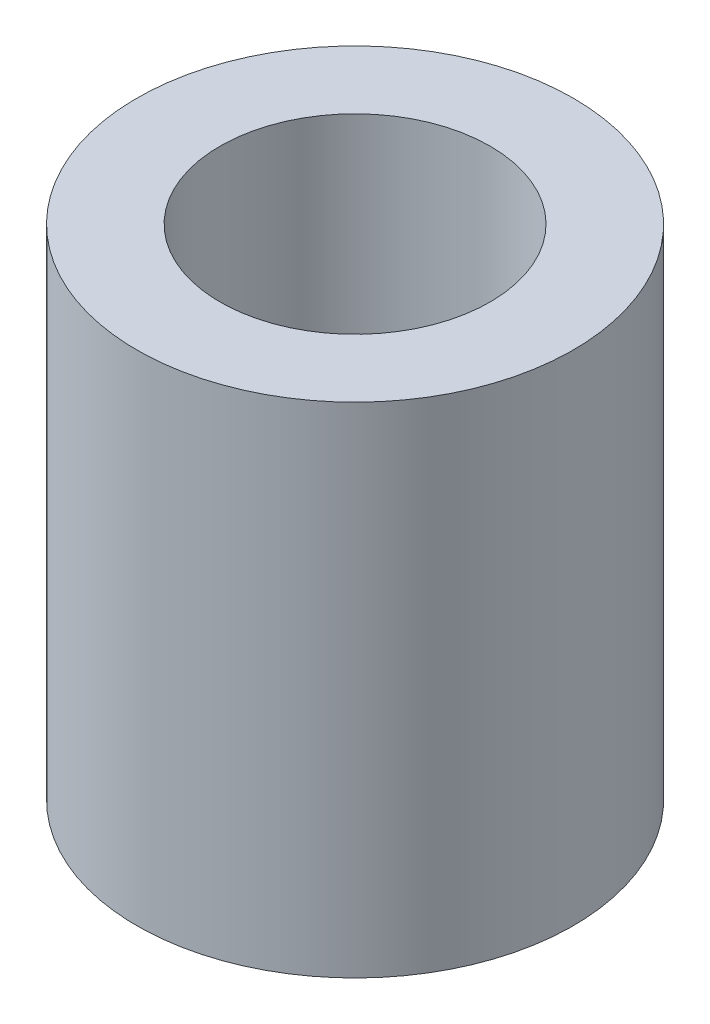
ISO-10303-21;
HEADER;
FILE_DESCRIPTION(('STEP AP214'),'2;1');
FILE_NAME('part.step','',(''),(''),'','','');
FILE_SCHEMA(('AUTOMOTIVE_DESIGN { 1 0 10303 214 1 1 1 1 }'));
ENDSEC;
DATA;
#1=APPLICATION_CONTEXT('core data for automotive mechanical design processes');
#2=APPLICATION_PROTOCOL_DEFINITION('international standard','automotive_design',2000,#1);
#3=PRODUCT_CONTEXT('',#1,'mechanical');
#4=PRODUCT('Part','Part','',(#3));
#5=PRODUCT_RELATED_PRODUCT_CATEGORY('part','',(#4));
#6=PRODUCT_DEFINITION_FORMATION('','',#4);
#7=PRODUCT_DEFINITION_CONTEXT('part definition',#1,'design');
#8=PRODUCT_DEFINITION('design','',#6,#7);
#9=PRODUCT_DEFINITION_SHAPE('','',#8);
#10=(LENGTH_UNIT() NAMED_UNIT(*) SI_UNIT(.MILLI.,.METRE.));
#11=(NAMED_UNIT(*) PLANE_ANGLE_UNIT() SI_UNIT($,.RADIAN.));
#12=(NAMED_UNIT(*) SI_UNIT($,.STERADIAN.) SOLID_ANGLE_UNIT());
#13=UNCERTAINTY_MEASURE_WITH_UNIT(LENGTH_MEASURE(1.E-05),#10,'distance_accuracy_value','');
#14=(GEOMETRIC_REPRESENTATION_CONTEXT(3) GLOBAL_UNCERTAINTY_ASSIGNED_CONTEXT((#13)) GLOBAL_UNIT_ASSIGNED_CONTEXT((#10,
#11,#12)) REPRESENTATION_CONTEXT('',''));
#15=CARTESIAN_POINT('',(0.,0.,0.));
#16=DIRECTION('',(0.,0.,1.));
#17=DIRECTION('',(1.,0.,0.));
#18=AXIS2_PLACEMENT_3D('',#15,#16,#17);
#19=CARTESIAN_POINT('',(0.,76.2,0.));
#20=DIRECTION('',(0.,1.,0.));
#21=DIRECTION('',(0.,0.,1.));
#22=AXIS2_PLACEMENT_3D('',#19,#20,#21);
#23=PLANE('',#22);
#24=CARTESIAN_POINT('',(0.,76.2,0.));
#25=DIRECTION('',(0.,1.,0.));
#26=DIRECTION('',(0.,0.,1.));
#27=AXIS2_PLACEMENT_3D('',#24,#25,#26);
#28=CIRCLE('',#27,33.3375);
#29=CARTESIAN_POINT('',(0.,76.2,-33.3375));
#30=VERTEX_POINT('',#29);
#31=EDGE_CURVE('E10',#30,#30,#28,.T.);
#32=ORIENTED_EDGE('',*,*,#31,.T.);
#33=EDGE_LOOP('',(#32));
#34=FACE_BOUND('',#33,.T.);
#35=CARTESIAN_POINT('',(0.,76.2,0.));
#36=DIRECTION('',(0.,1.,0.));
#37=DIRECTION('',(0.,0.,1.));
#38=AXIS2_PLACEMENT_3D('',#35,#36,#37);
#39=CIRCLE('',#38,20.6375);
#40=CARTESIAN_POINT('',(0.,76.2,-20.6375));
#41=VERTEX_POINT('',#40);
#42=EDGE_CURVE('E50',#41,#41,#39,.T.);
#43=ORIENTED_EDGE('',*,*,#42,.F.);
#44=EDGE_LOOP('',(#43));
#45=FACE_BOUND('',#44,.T.);
#46=ADVANCED_FACE('F37',(#34,#45),#23,.T.);
#47=CARTESIAN_POINT('',(0.,0.,0.));
#48=DIRECTION('',(0.,1.,0.));
#49=DIRECTION('',(0.,0.,1.));
#50=AXIS2_PLACEMENT_3D('',#47,#48,#49);
#51=PLANE('',#50);
#52=CARTESIAN_POINT('',(0.,0.,0.));
#53=DIRECTION('',(0.,1.,0.));
#54=DIRECTION('',(0.,0.,1.));
#55=AXIS2_PLACEMENT_3D('',#52,#53,#54);
#56=CIRCLE('',#55,33.3375);
#57=CARTESIAN_POINT('',(0.,0.,-33.3375));
#58=VERTEX_POINT('',#57);
#59=EDGE_CURVE('E41',#58,#58,#56,.T.);
#60=ORIENTED_EDGE('',*,*,#59,.F.);
#61=EDGE_LOOP('',(#60));
#62=FACE_BOUND('',#61,.T.);
#63=CARTESIAN_POINT('',(0.,0.,0.));
#64=DIRECTION('',(0.,1.,0.));
#65=DIRECTION('',(0.,0.,1.));
#66=AXIS2_PLACEMENT_3D('',#63,#64,#65);
#67=CIRCLE('',#66,20.6375);
#68=CARTESIAN_POINT('',(0.,0.,-20.6375));
#69=VERTEX_POINT('',#68);
#70=EDGE_CURVE('E52',#69,#69,#67,.T.);
#71=ORIENTED_EDGE('',*,*,#70,.T.);
#72=EDGE_LOOP('',(#71));
#73=FACE_BOUND('',#72,.T.);
#74=ADVANCED_FACE('F64',(#62,#73),#51,.F.);
#75=CARTESIAN_POINT('',(0.,76.2,0.));
#76=DIRECTION('',(0.,-1.,0.));
#77=DIRECTION('',(0.,0.,-1.));
#78=AXIS2_PLACEMENT_3D('',#75,#76,#77);
#79=CYLINDRICAL_SURFACE('',#78,33.3375);
#80=CARTESIAN_POINT('',(0.,76.2,-33.3375));
#81=CARTESIAN_POINT('',(0.,75.40625,-33.3375));
#82=CARTESIAN_POINT('',(0.,74.6125,-33.3375));
#83=CARTESIAN_POINT('',(0.,73.025,-33.3375));
#84=CARTESIAN_POINT('',(0.,72.23125,-33.3375));
#85=CARTESIAN_POINT('',(0.,70.64375,-33.3375));
#86=CARTESIAN_POINT('',(0.,69.85,-33.3375));
#87=CARTESIAN_POINT('',(0.,68.2625,-33.3375));
#88=CARTESIAN_POINT('',(0.,67.46875,-33.3375));
#89=CARTESIAN_POINT('',(0.,65.88125,-33.3375));
#90=CARTESIAN_POINT('',(0.,65.0875,-33.3375));
#91=CARTESIAN_POINT('',(0.,63.5,-33.3375));
#92=CARTESIAN_POINT('',(0.,62.70625,-33.3375));
#93=CARTESIAN_POINT('',(0.,61.11875,-33.3375));
#94=CARTESIAN_POINT('',(0.,60.325,-33.3375));
#95=CARTESIAN_POINT('',(0.,58.7375,-33.3375));
#96=CARTESIAN_POINT('',(0.,57.94375,-33.3375));
#97=CARTESIAN_POINT('',(0.,56.35625,-33.3375));
#98=CARTESIAN_POINT('',(0.,55.5625,-33.3375));
#99=CARTESIAN_POINT('',(0.,53.975,-33.3375));
#100=CARTESIAN_POINT('',(0.,53.18125,-33.3375));
#101=CARTESIAN_POINT('',(0.,51.59375,-33.3375));
#102=CARTESIAN_POINT('',(0.,50.8,-33.3375));
#103=CARTESIAN_POINT('',(0.,49.2125,-33.3375));
#104=CARTESIAN_POINT('',(0.,48.41875,-33.3375));
#105=CARTESIAN_POINT('',(0.,46.83125,-33.3375));
#106=CARTESIAN_POINT('',(0.,46.0375,-33.3375));
#107=CARTESIAN_POINT('',(0.,44.45,-33.3375));
#108=CARTESIAN_POINT('',(0.,43.65625,-33.3375));
#109=CARTESIAN_POINT('',(0.,42.06875,-33.3375));
#110=CARTESIAN_POINT('',(0.,41.275,-33.3375));
#111=CARTESIAN_POINT('',(0.,39.6875,-33.3375));
#112=CARTESIAN_POINT('',(0.,38.89375,-33.3375));
#113=CARTESIAN_POINT('',(0.,37.30625,-33.3375));
#114=CARTESIAN_POINT('',(0.,36.5125,-33.3375));
#115=CARTESIAN_POINT('',(0.,34.925,-33.3375));
#116=CARTESIAN_POINT('',(0.,34.13125,-33.3375));
#117=CARTESIAN_POINT('',(0.,32.54375,-33.3375));
#118=CARTESIAN_POINT('',(0.,31.75,-33.3375));
#119=CARTESIAN_POINT('',(0.,30.1625,-33.3375));
#120=CARTESIAN_POINT('',(0.,29.36875,-33.3375));
#121=CARTESIAN_POINT('',(0.,27.78125,-33.3375));
#122=CARTESIAN_POINT('',(0.,26.9875,-33.3375));
#123=CARTESIAN_POINT('',(0.,25.4,-33.3375));
#124=CARTESIAN_POINT('',(0.,24.60625,-33.3375));
#125=CARTESIAN_POINT('',(0.,23.01875,-33.3375));
#126=CARTESIAN_POINT('',(0.,22.225,-33.3375));
#127=CARTESIAN_POINT('',(0.,20.6375,-33.3375));
#128=CARTESIAN_POINT('',(0.,19.84375,-33.3375));
#129=CARTESIAN_POINT('',(0.,18.25625,-33.3375));
#130=CARTESIAN_POINT('',(0.,17.4625,-33.3375));
#131=CARTESIAN_POINT('',(0.,15.875,-33.3375));
#132=CARTESIAN_POINT('',(0.,15.08125,-33.3375));
#133=CARTESIAN_POINT('',(0.,13.49375,-33.3375));
#134=CARTESIAN_POINT('',(0.,12.7,-33.3375));
#135=CARTESIAN_POINT('',(0.,11.1125,-33.3375));
#136=CARTESIAN_POINT('',(0.,10.31875,-33.3375));
#137=CARTESIAN_POINT('',(0.,8.73125,-33.3375));
#138=CARTESIAN_POINT('',(0.,7.93750000000001,-33.3375));
#139=CARTESIAN_POINT('',(0.,6.35,-33.3375));
#140=CARTESIAN_POINT('',(0.,5.55625,-33.3375));
#141=CARTESIAN_POINT('',(0.,3.96875,-33.3375));
#142=CARTESIAN_POINT('',(0.,3.175,-33.3375));
#143=CARTESIAN_POINT('',(0.,1.5875,-33.3375));
#144=CARTESIAN_POINT('',(0.,0.793750000000001,-33.3375));
#145=CARTESIAN_POINT('',(0.,0.,-33.3375));
#146=B_SPLINE_CURVE_WITH_KNOTS('',3,(#80,#81,#82,#83,#84,#85,#86,#87,#88,#89,#90,#91,#92,#93,
#94,#95,#96,#97,#98,#99,#100,#101,#102,#103,#104,#105,#106,#107,#108,#109,#110,#111,#112,#113,
#114,#115,#116,#117,#118,#119,#120,#121,#122,#123,#124,#125,#126,#127,#128,#129,#130,#131,#132,
#133,#134,#135,#136,#137,#138,#139,#140,#141,#142,#143,#144,#145),.UNSPECIFIED.,.F.,.F.,(4,2,2,
2,2,2,2,2,2,2,2,2,2,2,2,2,2,2,2,2,2,2,2,2,2,2,2,2,2,2,2,2,4),(0.,2.38124999999999,
4.76249999999999,7.14374999999999,9.52499999999999,11.90625,14.2875,16.66875,19.05,21.43125,
23.8125,26.19375,28.575,30.95625,33.3375,35.71875,38.1,40.48125,42.8625,45.24375,47.625,
50.00625,52.3875,54.76875,57.15,59.53125,61.9125,64.29375,66.675,69.05625,71.4375,73.81875,
76.2),.UNSPECIFIED.);
#147=EDGE_CURVE('BSEAM39',#30,#58,#146,.T.);
#148=ORIENTED_EDGE('',*,*,#31,.F.);
#149=ORIENTED_EDGE('',*,*,#59,.T.);
#150=ORIENTED_EDGE('',*,*,#147,.T.);
#151=ORIENTED_EDGE('',*,*,#147,.F.);
#152=EDGE_LOOP('',(#148,#150,#149,#151));
#153=FACE_BOUND('',#152,.T.);
#154=ADVANCED_FACE('F39',(#153),#79,.T.);
#155=CARTESIAN_POINT('',(0.,76.2,0.));
#156=DIRECTION('',(0.,-1.,0.));
#157=DIRECTION('',(0.,0.,-1.));
#158=AXIS2_PLACEMENT_3D('',#155,#156,#157);
#159=CYLINDRICAL_SURFACE('',#158,20.6375);
#160=CARTESIAN_POINT('',(0.,76.2,-20.6375));
#161=CARTESIAN_POINT('',(0.,75.40625,-20.6375));
#162=CARTESIAN_POINT('',(0.,74.6125,-20.6375));
#163=CARTESIAN_POINT('',(0.,73.025,-20.6375));
#164=CARTESIAN_POINT('',(0.,72.23125,-20.6375));
#165=CARTESIAN_POINT('',(0.,70.64375,-20.6375));
#166=CARTESIAN_POINT('',(0.,69.85,-20.6375));
#167=CARTESIAN_POINT('',(0.,68.2625,-20.6375));
#168=CARTESIAN_POINT('',(0.,67.46875,-20.6375));
#169=CARTESIAN_POINT('',(0.,65.88125,-20.6375));
#170=CARTESIAN_POINT('',(0.,65.0875,-20.6375));
#171=CARTESIAN_POINT('',(0.,63.5,-20.6375));
#172=CARTESIAN_POINT('',(0.,62.70625,-20.6375));
#173=CARTESIAN_POINT('',(0.,61.11875,-20.6375));
#174=CARTESIAN_POINT('',(0.,60.325,-20.6375));
#175=CARTESIAN_POINT('',(0.,58.7375,-20.6375));
#176=CARTESIAN_POINT('',(0.,57.94375,-20.6375));
#177=CARTESIAN_POINT('',(0.,56.35625,-20.6375));
#178=CARTESIAN_POINT('',(0.,55.5625,-20.6375));
#179=CARTESIAN_POINT('',(0.,53.975,-20.6375));
#180=CARTESIAN_POINT('',(0.,53.18125,-20.6375));
#181=CARTESIAN_POINT('',(0.,51.59375,-20.6375));
#182=CARTESIAN_POINT('',(0.,50.8,-20.6375));
#183=CARTESIAN_POINT('',(0.,49.2125,-20.6375));
#184=CARTESIAN_POINT('',(0.,48.41875,-20.6375));
#185=CARTESIAN_POINT('',(0.,46.83125,-20.6375));
#186=CARTESIAN_POINT('',(0.,46.0375,-20.6375));
#187=CARTESIAN_POINT('',(0.,44.45,-20.6375));
#188=CARTESIAN_POINT('',(0.,43.65625,-20.6375));
#189=CARTESIAN_POINT('',(0.,42.06875,-20.6375));
#190=CARTESIAN_POINT('',(0.,41.275,-20.6375));
#191=CARTESIAN_POINT('',(0.,39.6875,-20.6375));
#192=CARTESIAN_POINT('',(0.,38.89375,-20.6375));
#193=CARTESIAN_POINT('',(0.,37.30625,-20.6375));
#194=CARTESIAN_POINT('',(0.,36.5125,-20.6375));
#195=CARTESIAN_POINT('',(0.,34.925,-20.6375));
#196=CARTESIAN_POINT('',(0.,34.13125,-20.6375));
#197=CARTESIAN_POINT('',(0.,32.54375,-20.6375));
#198=CARTESIAN_POINT('',(0.,31.75,-20.6375));
#199=CARTESIAN_POINT('',(0.,30.1625,-20.6375));
#200=CARTESIAN_POINT('',(0.,29.36875,-20.6375));
#201=CARTESIAN_POINT('',(0.,27.78125,-20.6375));
#202=CARTESIAN_POINT('',(0.,26.9875,-20.6375));
#203=CARTESIAN_POINT('',(0.,25.4,-20.6375));
#204=CARTESIAN_POINT('',(0.,24.60625,-20.6375));
#205=CARTESIAN_POINT('',(0.,23.01875,-20.6375));
#206=CARTESIAN_POINT('',(0.,22.225,-20.6375));
#207=CARTESIAN_POINT('',(0.,20.6375,-20.6375));
#208=CARTESIAN_POINT('',(0.,19.84375,-20.6375));
#209=CARTESIAN_POINT('',(0.,18.25625,-20.6375));
#210=CARTESIAN_POINT('',(0.,17.4625,-20.6375));
#211=CARTESIAN_POINT('',(0.,15.875,-20.6375));
#212=CARTESIAN_POINT('',(0.,15.08125,-20.6375));
#213=CARTESIAN_POINT('',(0.,13.49375,-20.6375));
#214=CARTESIAN_POINT('',(0.,12.7,-20.6375));
#215=CARTESIAN_POINT('',(0.,11.1125,-20.6375));
#216=CARTESIAN_POINT('',(0.,10.31875,-20.6375));
#217=CARTESIAN_POINT('',(0.,8.73125,-20.6375));
#218=CARTESIAN_POINT('',(0.,7.93750000000001,-20.6375));
#219=CARTESIAN_POINT('',(0.,6.35,-20.6375));
#220=CARTESIAN_POINT('',(0.,5.55625,-20.6375));
#221=CARTESIAN_POINT('',(0.,3.96875,-20.6375));
#222=CARTESIAN_POINT('',(0.,3.175,-20.6375));
#223=CARTESIAN_POINT('',(0.,1.5875,-20.6375));
#224=CARTESIAN_POINT('',(0.,0.793750000000001,-20.6375));
#225=CARTESIAN_POINT('',(0.,0.,-20.6375));
#226=B_SPLINE_CURVE_WITH_KNOTS('',3,(#160,#161,#162,#163,#164,#165,#166,#167,#168,#169,#170,
#171,#172,#173,#174,#175,#176,#177,#178,#179,#180,#181,#182,#183,#184,#185,#186,#187,#188,#189,
#190,#191,#192,#193,#194,#195,#196,#197,#198,#199,#200,#201,#202,#203,#204,#205,#206,#207,#208,
#209,#210,#211,#212,#213,#214,#215,#216,#217,#218,#219,#220,#221,#222,#223,#224,#225),
.UNSPECIFIED.,.F.,.F.,(4,2,2,2,2,2,2,2,2,2,2,2,2,2,2,2,2,2,2,2,2,2,2,2,2,2,2,2,2,2,2,2,4),(0.,
2.38124999999999,4.76249999999999,7.14374999999999,9.52499999999999,11.90625,14.2875,16.66875,
19.05,21.43125,23.8125,26.19375,28.575,30.95625,33.3375,35.71875,38.1,40.48125,42.8625,45.24375,
47.625,50.00625,52.3875,54.76875,57.15,59.53125,61.9125,64.29375,66.675,69.05625,71.4375,
73.81875,76.2),.UNSPECIFIED.);
#227=EDGE_CURVE('BSEAM60',#41,#69,#226,.T.);
#228=ORIENTED_EDGE('',*,*,#42,.T.);
#229=ORIENTED_EDGE('',*,*,#70,.F.);
#230=ORIENTED_EDGE('',*,*,#227,.T.);
#231=ORIENTED_EDGE('',*,*,#227,.F.);
#232=EDGE_LOOP('',(#228,#230,#229,#231));
#233=FACE_BOUND('',#232,.T.);
#234=ADVANCED_FACE('F60',(#233),#159,.F.);
#235=CLOSED_SHELL('',(#46,#74,#154,#234));
#236=MANIFOLD_SOLID_BREP('B2',#235);
#237=ADVANCED_BREP_SHAPE_REPRESENTATION('',(#18,#236),#14);
#238=SHAPE_DEFINITION_REPRESENTATION(#9,#237);
ENDSEC;
END-ISO-10303-21;
